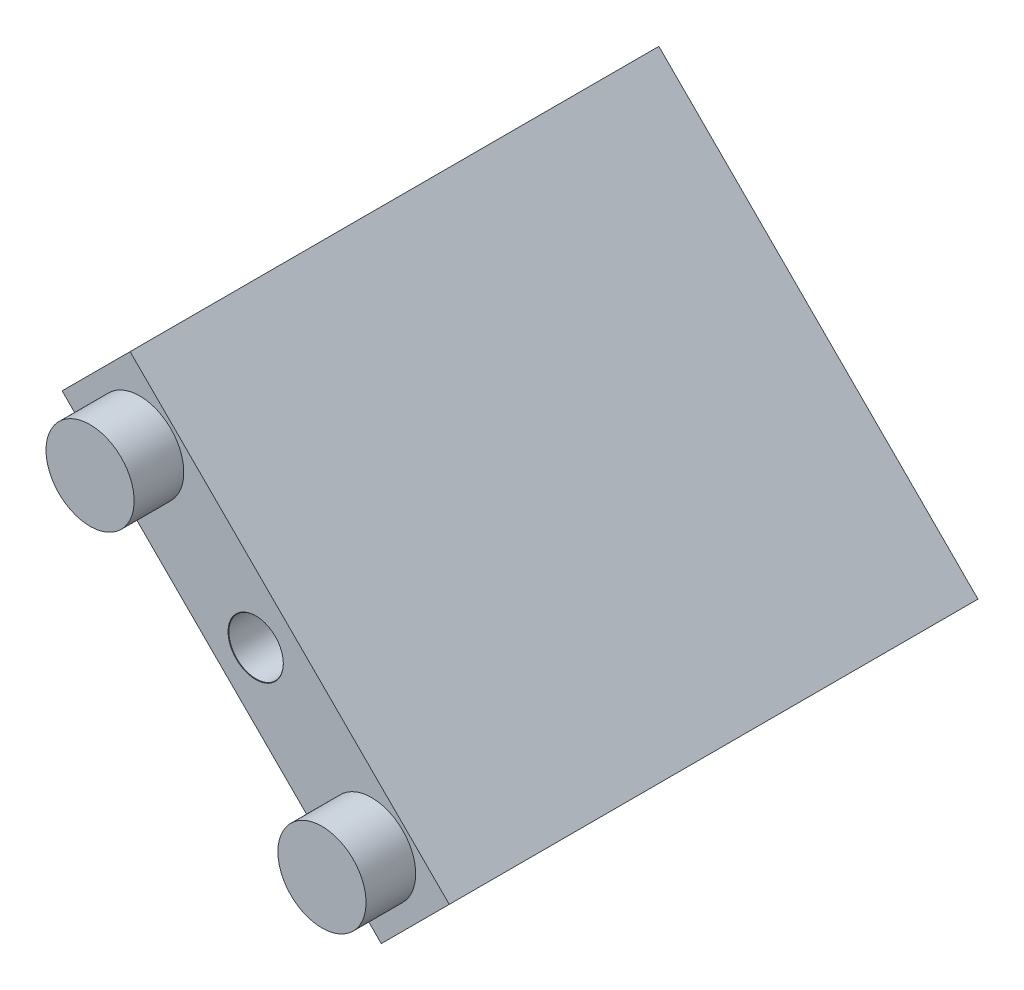
ISO-10303-21;
HEADER;
FILE_DESCRIPTION(('STEP AP214'),'2;1');
FILE_NAME('part.step','',(''),(''),'','','');
FILE_SCHEMA(('AUTOMOTIVE_DESIGN { 1 0 10303 214 1 1 1 1 }'));
ENDSEC;
DATA;
#1=APPLICATION_CONTEXT('core data for automotive mechanical design processes');
#2=APPLICATION_PROTOCOL_DEFINITION('international standard','automotive_design',2000,#1);
#3=PRODUCT_CONTEXT('',#1,'mechanical');
#4=PRODUCT('Part','Part','',(#3));
#5=PRODUCT_RELATED_PRODUCT_CATEGORY('part','',(#4));
#6=PRODUCT_DEFINITION_FORMATION('','',#4);
#7=PRODUCT_DEFINITION_CONTEXT('part definition',#1,'design');
#8=PRODUCT_DEFINITION('design','',#6,#7);
#9=PRODUCT_DEFINITION_SHAPE('','',#8);
#10=(LENGTH_UNIT() NAMED_UNIT(*) SI_UNIT(.MILLI.,.METRE.));
#11=(NAMED_UNIT(*) PLANE_ANGLE_UNIT() SI_UNIT($,.RADIAN.));
#12=(NAMED_UNIT(*) SI_UNIT($,.STERADIAN.) SOLID_ANGLE_UNIT());
#13=UNCERTAINTY_MEASURE_WITH_UNIT(LENGTH_MEASURE(1.E-05),#10,'distance_accuracy_value','');
#14=(GEOMETRIC_REPRESENTATION_CONTEXT(3) GLOBAL_UNCERTAINTY_ASSIGNED_CONTEXT((#13)) GLOBAL_UNIT_ASSIGNED_CONTEXT((#10,
#11,#12)) REPRESENTATION_CONTEXT('',''));
#15=CARTESIAN_POINT('',(0.,0.,0.));
#16=DIRECTION('',(0.,0.,1.));
#17=DIRECTION('',(1.,0.,0.));
#18=AXIS2_PLACEMENT_3D('',#15,#16,#17);
#19=CARTESIAN_POINT('',(-2.79532834472425,16.9362189533206,33.));
#20=DIRECTION('',(0.707106781186547,0.707106781186548,0.));
#21=DIRECTION('',(-0.707106781186548,0.707106781186547,0.));
#22=AXIS2_PLACEMENT_3D('',#19,#20,#21);
#23=PLANE('',#22);
#24=DIRECTION('',(0.707106781186547,-0.707106781186547,0.));
#25=VECTOR('',#24,1.);
#26=CARTESIAN_POINT('',(-2.79532834472425,16.9362189533206,0.));
#27=LINE('',#26,#25);
#28=CARTESIAN_POINT('',(-2.79532834472425,16.9362189533206,0.));
#29=VERTEX_POINT('',#28);
#30=CARTESIAN_POINT('',(17.1238696813008,-2.98297907270444,0.));
#31=VERTEX_POINT('',#30);
#32=EDGE_CURVE('E110',#29,#31,#27,.T.);
#33=ORIENTED_EDGE('',*,*,#32,.T.);
#34=DIRECTION('',(0.,0.,-1.));
#35=VECTOR('',#34,1.);
#36=CARTESIAN_POINT('',(17.1238696813008,-2.98297907270444,33.));
#37=LINE('',#36,#35);
#38=CARTESIAN_POINT('',(17.1238696813008,-2.98297907270444,33.));
#39=VERTEX_POINT('',#38);
#40=EDGE_CURVE('E11',#39,#31,#37,.T.);
#41=ORIENTED_EDGE('',*,*,#40,.F.);
#42=DIRECTION('',(0.707106781186547,-0.707106781186547,0.));
#43=VECTOR('',#42,1.);
#44=CARTESIAN_POINT('',(-2.79532834472425,16.9362189533206,33.));
#45=LINE('',#44,#43);
#46=CARTESIAN_POINT('',(-2.79532834472425,16.9362189533206,33.));
#47=VERTEX_POINT('',#46);
#48=EDGE_CURVE('E113',#47,#39,#45,.T.);
#49=ORIENTED_EDGE('',*,*,#48,.F.);
#50=DIRECTION('',(0.,0.,-1.));
#51=VECTOR('',#50,1.);
#52=CARTESIAN_POINT('',(-2.79532834472425,16.9362189533206,33.));
#53=LINE('',#52,#51);
#54=EDGE_CURVE('E119',#47,#29,#53,.T.);
#55=ORIENTED_EDGE('',*,*,#54,.T.);
#56=EDGE_LOOP('',(#33,#41,#49,#55));
#57=FACE_BOUND('',#56,.T.);
#58=ADVANCED_FACE('F32',(#57),#23,.F.);
#59=CARTESIAN_POINT('',(17.1238696813008,-2.98297907270444,33.));
#60=DIRECTION('',(-0.707106781186548,0.707106781186547,0.));
#61=DIRECTION('',(-0.707106781186547,-0.707106781186548,0.));
#62=AXIS2_PLACEMENT_3D('',#59,#60,#61);
#63=PLANE('',#62);
#64=DIRECTION('',(0.707106781186547,0.707106781186548,0.));
#65=VECTOR('',#64,1.);
#66=CARTESIAN_POINT('',(17.1238696813008,-2.98297907270444,0.));
#67=LINE('',#66,#65);
#68=CARTESIAN_POINT('',(21.3665103684201,1.25966161441484,0.));
#69=VERTEX_POINT('',#68);
#70=EDGE_CURVE('E122',#31,#69,#67,.T.);
#71=ORIENTED_EDGE('',*,*,#70,.T.);
#72=DIRECTION('',(0.,0.,-1.));
#73=VECTOR('',#72,1.);
#74=CARTESIAN_POINT('',(21.3665103684201,1.25966161441484,33.));
#75=LINE('',#74,#73);
#76=CARTESIAN_POINT('',(21.3665103684201,1.25966161441484,33.));
#77=VERTEX_POINT('',#76);
#78=EDGE_CURVE('E40',#77,#69,#75,.T.);
#79=ORIENTED_EDGE('',*,*,#78,.F.);
#80=DIRECTION('',(0.707106781186547,0.707106781186548,0.));
#81=VECTOR('',#80,1.);
#82=CARTESIAN_POINT('',(17.1238696813008,-2.98297907270444,33.));
#83=LINE('',#82,#81);
#84=EDGE_CURVE('E79',#39,#77,#83,.T.);
#85=ORIENTED_EDGE('',*,*,#84,.F.);
#86=ORIENTED_EDGE('',*,*,#40,.T.);
#87=EDGE_LOOP('',(#71,#79,#85,#86));
#88=FACE_BOUND('',#87,.T.);
#89=ADVANCED_FACE('F146',(#88),#63,.F.);
#90=CARTESIAN_POINT('',(21.3665103684201,1.25966161441484,33.));
#91=DIRECTION('',(-0.707106781186548,-0.707106781186547,0.));
#92=DIRECTION('',(0.707106781186547,-0.707106781186548,0.));
#93=AXIS2_PLACEMENT_3D('',#90,#91,#92);
#94=PLANE('',#93);
#95=DIRECTION('',(-0.707106781186547,0.707106781186548,0.));
#96=VECTOR('',#95,1.);
#97=CARTESIAN_POINT('',(21.3665103684201,1.25966161441484,0.));
#98=LINE('',#97,#96);
#99=CARTESIAN_POINT('',(1.44731234239504,21.1788596404399,0.));
#100=VERTEX_POINT('',#99);
#101=EDGE_CURVE('E66',#69,#100,#98,.T.);
#102=ORIENTED_EDGE('',*,*,#101,.T.);
#103=DIRECTION('',(0.,0.,-1.));
#104=VECTOR('',#103,1.);
#105=CARTESIAN_POINT('',(1.44731234239504,21.1788596404399,33.));
#106=LINE('',#105,#104);
#107=CARTESIAN_POINT('',(1.44731234239504,21.1788596404399,33.));
#108=VERTEX_POINT('',#107);
#109=EDGE_CURVE('E127',#108,#100,#106,.T.);
#110=ORIENTED_EDGE('',*,*,#109,.F.);
#111=DIRECTION('',(-0.707106781186547,0.707106781186548,0.));
#112=VECTOR('',#111,1.);
#113=CARTESIAN_POINT('',(21.3665103684201,1.25966161441484,33.));
#114=LINE('',#113,#112);
#115=EDGE_CURVE('E116',#77,#108,#114,.T.);
#116=ORIENTED_EDGE('',*,*,#115,.F.);
#117=ORIENTED_EDGE('',*,*,#78,.T.);
#118=EDGE_LOOP('',(#102,#110,#116,#117));
#119=FACE_BOUND('',#118,.T.);
#120=ADVANCED_FACE('F129',(#119),#94,.F.);
#121=CARTESIAN_POINT('',(1.44731234239504,21.1788596404399,33.));
#122=DIRECTION('',(0.707106781186547,-0.707106781186547,0.));
#123=DIRECTION('',(0.707106781186548,0.707106781186548,0.));
#124=AXIS2_PLACEMENT_3D('',#121,#122,#123);
#125=PLANE('',#124);
#126=DIRECTION('',(-0.707106781186548,-0.707106781186548,0.));
#127=VECTOR('',#126,1.);
#128=CARTESIAN_POINT('',(1.44731234239504,21.1788596404399,0.));
#129=LINE('',#128,#127);
#130=EDGE_CURVE('E72',#100,#29,#129,.T.);
#131=ORIENTED_EDGE('',*,*,#130,.T.);
#132=ORIENTED_EDGE('',*,*,#54,.F.);
#133=DIRECTION('',(-0.707106781186548,-0.707106781186548,0.));
#134=VECTOR('',#133,1.);
#135=CARTESIAN_POINT('',(1.44731234239504,21.1788596404399,33.));
#136=LINE('',#135,#134);
#137=EDGE_CURVE('E48',#108,#47,#136,.T.);
#138=ORIENTED_EDGE('',*,*,#137,.F.);
#139=ORIENTED_EDGE('',*,*,#109,.T.);
#140=EDGE_LOOP('',(#131,#132,#138,#139));
#141=FACE_BOUND('',#140,.T.);
#142=ADVANCED_FACE('F136',(#141),#125,.F.);
#143=CARTESIAN_POINT('',(0.,0.,33.));
#144=DIRECTION('',(0.,0.,1.));
#145=DIRECTION('',(1.,0.,0.));
#146=AXIS2_PLACEMENT_3D('',#143,#144,#145);
#147=PLANE('',#146);
#148=CARTESIAN_POINT('',(9.28559101184792,9.09794028386772,33.));
#149=DIRECTION('',(0.,0.,1.));
#150=DIRECTION('',(1.,0.,0.));
#151=AXIS2_PLACEMENT_3D('',#148,#149,#150);
#152=CIRCLE('',#151,1.725);
#153=CARTESIAN_POINT('',(11.0105910118479,9.09794028386772,33.));
#154=VERTEX_POINT('',#153);
#155=EDGE_CURVE('E100',#154,#154,#152,.T.);
#156=ORIENTED_EDGE('',*,*,#155,.F.);
#157=EDGE_LOOP('',(#156));
#158=FACE_BOUND('',#157,.T.);
#159=CARTESIAN_POINT('',(16.5228289172922,1.8607023784234,33.));
#160=DIRECTION('',(0.,0.,1.));
#161=DIRECTION('',(1.,0.,0.));
#162=AXIS2_PLACEMENT_3D('',#159,#160,#161);
#163=CIRCLE('',#162,2.75);
#164=CARTESIAN_POINT('',(13.7728289172922,1.8607023784234,33.));
#165=VERTEX_POINT('',#164);
#166=EDGE_CURVE('E93',#165,#165,#163,.T.);
#167=ORIENTED_EDGE('',*,*,#166,.F.);
#168=EDGE_LOOP('',(#167));
#169=FACE_BOUND('',#168,.T.);
#170=CARTESIAN_POINT('',(2.0483531064036,16.335178189312,33.));
#171=DIRECTION('',(0.,0.,1.));
#172=DIRECTION('',(1.,0.,0.));
#173=AXIS2_PLACEMENT_3D('',#170,#171,#172);
#174=CIRCLE('',#173,2.75);
#175=CARTESIAN_POINT('',(-0.701646893596396,16.335178189312,33.));
#176=VERTEX_POINT('',#175);
#177=EDGE_CURVE('E105',#176,#176,#174,.T.);
#178=ORIENTED_EDGE('',*,*,#177,.F.);
#179=EDGE_LOOP('',(#178));
#180=FACE_BOUND('',#179,.T.);
#181=ORIENTED_EDGE('',*,*,#48,.T.);
#182=ORIENTED_EDGE('',*,*,#84,.T.);
#183=ORIENTED_EDGE('',*,*,#115,.T.);
#184=ORIENTED_EDGE('',*,*,#137,.T.);
#185=EDGE_LOOP('',(#181,#182,#183,#184));
#186=FACE_BOUND('',#185,.T.);
#187=ADVANCED_FACE('F138',(#158,#169,#180,#186),#147,.T.);
#188=CARTESIAN_POINT('',(0.,0.,0.));
#189=DIRECTION('',(0.,0.,1.));
#190=DIRECTION('',(1.,0.,0.));
#191=AXIS2_PLACEMENT_3D('',#188,#189,#190);
#192=PLANE('',#191);
#193=ORIENTED_EDGE('',*,*,#32,.F.);
#194=ORIENTED_EDGE('',*,*,#130,.F.);
#195=ORIENTED_EDGE('',*,*,#101,.F.);
#196=ORIENTED_EDGE('',*,*,#70,.F.);
#197=EDGE_LOOP('',(#193,#194,#195,#196));
#198=FACE_BOUND('',#197,.T.);
#199=ADVANCED_FACE('F132',(#198),#192,.F.);
#200=CARTESIAN_POINT('',(2.0483531064036,16.335178189312,36.1));
#201=DIRECTION('',(0.,0.,-1.));
#202=DIRECTION('',(-1.,0.,0.));
#203=AXIS2_PLACEMENT_3D('',#200,#201,#202);
#204=CYLINDRICAL_SURFACE('',#203,2.75);
#205=CARTESIAN_POINT('',(2.0483531064036,16.335178189312,36.1));
#206=DIRECTION('',(0.,0.,1.));
#207=DIRECTION('',(1.,0.,0.));
#208=AXIS2_PLACEMENT_3D('',#205,#206,#207);
#209=CIRCLE('',#208,2.75);
#210=CARTESIAN_POINT('',(-0.701646893596396,16.335178189312,36.1));
#211=VERTEX_POINT('',#210);
#212=EDGE_CURVE('E107',#211,#211,#209,.T.);
#213=CARTESIAN_POINT('',(-0.701646893596396,16.335178189312,36.1));
#214=CARTESIAN_POINT('',(-0.701646893596396,16.335178189312,36.0677083333333));
#215=CARTESIAN_POINT('',(-0.701646893596396,16.335178189312,36.0354166666667));
#216=CARTESIAN_POINT('',(-0.701646893596396,16.335178189312,35.9708333333333));
#217=CARTESIAN_POINT('',(-0.701646893596396,16.335178189312,35.9385416666667));
#218=CARTESIAN_POINT('',(-0.701646893596396,16.335178189312,35.8739583333333));
#219=CARTESIAN_POINT('',(-0.701646893596396,16.335178189312,35.8416666666667));
#220=CARTESIAN_POINT('',(-0.701646893596396,16.335178189312,35.7770833333333));
#221=CARTESIAN_POINT('',(-0.701646893596396,16.335178189312,35.7447916666667));
#222=CARTESIAN_POINT('',(-0.701646893596396,16.335178189312,35.6802083333333));
#223=CARTESIAN_POINT('',(-0.701646893596396,16.335178189312,35.6479166666667));
#224=CARTESIAN_POINT('',(-0.701646893596396,16.335178189312,35.5833333333333));
#225=CARTESIAN_POINT('',(-0.701646893596396,16.335178189312,35.5510416666667));
#226=CARTESIAN_POINT('',(-0.701646893596396,16.335178189312,35.4864583333333));
#227=CARTESIAN_POINT('',(-0.701646893596396,16.335178189312,35.4541666666667));
#228=CARTESIAN_POINT('',(-0.701646893596396,16.335178189312,35.3895833333333));
#229=CARTESIAN_POINT('',(-0.701646893596396,16.335178189312,35.3572916666667));
#230=CARTESIAN_POINT('',(-0.701646893596396,16.335178189312,35.2927083333333));
#231=CARTESIAN_POINT('',(-0.701646893596396,16.335178189312,35.2604166666667));
#232=CARTESIAN_POINT('',(-0.701646893596396,16.335178189312,35.1958333333333));
#233=CARTESIAN_POINT('',(-0.701646893596396,16.335178189312,35.1635416666667));
#234=CARTESIAN_POINT('',(-0.701646893596396,16.335178189312,35.0989583333333));
#235=CARTESIAN_POINT('',(-0.701646893596396,16.335178189312,35.0666666666667));
#236=CARTESIAN_POINT('',(-0.701646893596396,16.335178189312,35.0020833333333));
#237=CARTESIAN_POINT('',(-0.701646893596396,16.335178189312,34.9697916666667));
#238=CARTESIAN_POINT('',(-0.701646893596396,16.335178189312,34.9052083333333));
#239=CARTESIAN_POINT('',(-0.701646893596396,16.335178189312,34.8729166666667));
#240=CARTESIAN_POINT('',(-0.701646893596396,16.335178189312,34.8083333333333));
#241=CARTESIAN_POINT('',(-0.701646893596396,16.335178189312,34.7760416666667));
#242=CARTESIAN_POINT('',(-0.701646893596396,16.335178189312,34.7114583333333));
#243=CARTESIAN_POINT('',(-0.701646893596396,16.335178189312,34.6791666666667));
#244=CARTESIAN_POINT('',(-0.701646893596396,16.335178189312,34.6145833333333));
#245=CARTESIAN_POINT('',(-0.701646893596396,16.335178189312,34.5822916666667));
#246=CARTESIAN_POINT('',(-0.701646893596396,16.335178189312,34.5177083333333));
#247=CARTESIAN_POINT('',(-0.701646893596396,16.335178189312,34.4854166666667));
#248=CARTESIAN_POINT('',(-0.701646893596396,16.335178189312,34.4208333333333));
#249=CARTESIAN_POINT('',(-0.701646893596396,16.335178189312,34.3885416666667));
#250=CARTESIAN_POINT('',(-0.701646893596396,16.335178189312,34.3239583333333));
#251=CARTESIAN_POINT('',(-0.701646893596396,16.335178189312,34.2916666666667));
#252=CARTESIAN_POINT('',(-0.701646893596396,16.335178189312,34.2270833333333));
#253=CARTESIAN_POINT('',(-0.701646893596396,16.335178189312,34.1947916666667));
#254=CARTESIAN_POINT('',(-0.701646893596396,16.335178189312,34.1302083333333));
#255=CARTESIAN_POINT('',(-0.701646893596396,16.335178189312,34.0979166666667));
#256=CARTESIAN_POINT('',(-0.701646893596396,16.335178189312,34.0333333333333));
#257=CARTESIAN_POINT('',(-0.701646893596396,16.335178189312,34.0010416666667));
#258=CARTESIAN_POINT('',(-0.701646893596396,16.335178189312,33.9364583333333));
#259=CARTESIAN_POINT('',(-0.701646893596396,16.335178189312,33.9041666666667));
#260=CARTESIAN_POINT('',(-0.701646893596396,16.335178189312,33.8395833333333));
#261=CARTESIAN_POINT('',(-0.701646893596396,16.335178189312,33.8072916666667));
#262=CARTESIAN_POINT('',(-0.701646893596396,16.335178189312,33.7427083333333));
#263=CARTESIAN_POINT('',(-0.701646893596396,16.335178189312,33.7104166666667));
#264=CARTESIAN_POINT('',(-0.701646893596396,16.335178189312,33.6458333333333));
#265=CARTESIAN_POINT('',(-0.701646893596396,16.335178189312,33.6135416666667));
#266=CARTESIAN_POINT('',(-0.701646893596396,16.335178189312,33.5489583333333));
#267=CARTESIAN_POINT('',(-0.701646893596396,16.335178189312,33.5166666666667));
#268=CARTESIAN_POINT('',(-0.701646893596396,16.335178189312,33.4520833333333));
#269=CARTESIAN_POINT('',(-0.701646893596396,16.335178189312,33.4197916666667));
#270=CARTESIAN_POINT('',(-0.701646893596396,16.335178189312,33.3552083333333));
#271=CARTESIAN_POINT('',(-0.701646893596396,16.335178189312,33.3229166666667));
#272=CARTESIAN_POINT('',(-0.701646893596396,16.335178189312,33.2583333333333));
#273=CARTESIAN_POINT('',(-0.701646893596396,16.335178189312,33.2260416666667));
#274=CARTESIAN_POINT('',(-0.701646893596396,16.335178189312,33.1614583333333));
#275=CARTESIAN_POINT('',(-0.701646893596396,16.335178189312,33.1291666666667));
#276=CARTESIAN_POINT('',(-0.701646893596396,16.335178189312,33.0645833333333));
#277=CARTESIAN_POINT('',(-0.701646893596396,16.335178189312,33.0322916666667));
#278=CARTESIAN_POINT('',(-0.701646893596396,16.335178189312,33.));
#279=B_SPLINE_CURVE_WITH_KNOTS('',3,(#213,#214,#215,#216,#217,#218,#219,#220,#221,#222,#223,
#224,#225,#226,#227,#228,#229,#230,#231,#232,#233,#234,#235,#236,#237,#238,#239,#240,#241,#242,
#243,#244,#245,#246,#247,#248,#249,#250,#251,#252,#253,#254,#255,#256,#257,#258,#259,#260,#261,
#262,#263,#264,#265,#266,#267,#268,#269,#270,#271,#272,#273,#274,#275,#276,#277,#278),
.UNSPECIFIED.,.F.,.F.,(4,2,2,2,2,2,2,2,2,2,2,2,2,2,2,2,2,2,2,2,2,2,2,2,2,2,2,2,2,2,2,2,4),(0.,
0.0968750000000032,0.193750000000006,0.290625000000003,0.387500000000006,0.484375000000002,
0.581250000000005,0.678125000000002,0.775000000000005,0.871875000000001,0.968750000000004,
1.065625,1.1625,1.259375,1.35625,1.45312500000001,1.55,1.64687500000001,1.74375,
1.84062500000001,1.9375,2.03437500000001,2.13125,2.228125,2.325,2.421875,2.51875,2.615625,
2.7125,2.809375,2.90625000000001,3.003125,3.10000000000001),.UNSPECIFIED.);
#280=EDGE_CURVE('BSEAM173',#211,#176,#279,.T.);
#281=ORIENTED_EDGE('',*,*,#212,.F.);
#282=ORIENTED_EDGE('',*,*,#177,.T.);
#283=ORIENTED_EDGE('',*,*,#280,.T.);
#284=ORIENTED_EDGE('',*,*,#280,.F.);
#285=EDGE_LOOP('',(#281,#283,#282,#284));
#286=FACE_BOUND('',#285,.T.);
#287=ADVANCED_FACE('F173',(#286),#204,.T.);
#288=CARTESIAN_POINT('',(2.0483531064036,16.335178189312,36.1));
#289=DIRECTION('',(0.,0.,1.));
#290=DIRECTION('',(1.,0.,0.));
#291=AXIS2_PLACEMENT_3D('',#288,#289,#290);
#292=PLANE('',#291);
#293=ORIENTED_EDGE('',*,*,#212,.T.);
#294=EDGE_LOOP('',(#293));
#295=FACE_BOUND('',#294,.T.);
#296=ADVANCED_FACE('F181',(#295),#292,.T.);
#297=CARTESIAN_POINT('',(16.5228289172922,1.8607023784234,36.1));
#298=DIRECTION('',(0.,0.,-1.));
#299=DIRECTION('',(-1.,0.,0.));
#300=AXIS2_PLACEMENT_3D('',#297,#298,#299);
#301=CYLINDRICAL_SURFACE('',#300,2.75);
#302=CARTESIAN_POINT('',(16.5228289172922,1.8607023784234,36.1));
#303=DIRECTION('',(0.,0.,1.));
#304=DIRECTION('',(1.,0.,0.));
#305=AXIS2_PLACEMENT_3D('',#302,#303,#304);
#306=CIRCLE('',#305,2.75);
#307=CARTESIAN_POINT('',(13.7728289172922,1.8607023784234,36.1));
#308=VERTEX_POINT('',#307);
#309=EDGE_CURVE('E97',#308,#308,#306,.T.);
#310=CARTESIAN_POINT('',(13.7728289172922,1.8607023784234,36.1));
#311=CARTESIAN_POINT('',(13.7728289172922,1.8607023784234,36.0677083333333));
#312=CARTESIAN_POINT('',(13.7728289172922,1.8607023784234,36.0354166666667));
#313=CARTESIAN_POINT('',(13.7728289172922,1.8607023784234,35.9708333333333));
#314=CARTESIAN_POINT('',(13.7728289172922,1.8607023784234,35.9385416666667));
#315=CARTESIAN_POINT('',(13.7728289172922,1.8607023784234,35.8739583333333));
#316=CARTESIAN_POINT('',(13.7728289172922,1.8607023784234,35.8416666666667));
#317=CARTESIAN_POINT('',(13.7728289172922,1.8607023784234,35.7770833333333));
#318=CARTESIAN_POINT('',(13.7728289172922,1.8607023784234,35.7447916666667));
#319=CARTESIAN_POINT('',(13.7728289172922,1.8607023784234,35.6802083333333));
#320=CARTESIAN_POINT('',(13.7728289172922,1.8607023784234,35.6479166666667));
#321=CARTESIAN_POINT('',(13.7728289172922,1.8607023784234,35.5833333333333));
#322=CARTESIAN_POINT('',(13.7728289172922,1.8607023784234,35.5510416666667));
#323=CARTESIAN_POINT('',(13.7728289172922,1.8607023784234,35.4864583333333));
#324=CARTESIAN_POINT('',(13.7728289172922,1.8607023784234,35.4541666666667));
#325=CARTESIAN_POINT('',(13.7728289172922,1.8607023784234,35.3895833333333));
#326=CARTESIAN_POINT('',(13.7728289172922,1.8607023784234,35.3572916666667));
#327=CARTESIAN_POINT('',(13.7728289172922,1.8607023784234,35.2927083333333));
#328=CARTESIAN_POINT('',(13.7728289172922,1.8607023784234,35.2604166666667));
#329=CARTESIAN_POINT('',(13.7728289172922,1.8607023784234,35.1958333333333));
#330=CARTESIAN_POINT('',(13.7728289172922,1.8607023784234,35.1635416666667));
#331=CARTESIAN_POINT('',(13.7728289172922,1.8607023784234,35.0989583333333));
#332=CARTESIAN_POINT('',(13.7728289172922,1.8607023784234,35.0666666666667));
#333=CARTESIAN_POINT('',(13.7728289172922,1.8607023784234,35.0020833333333));
#334=CARTESIAN_POINT('',(13.7728289172922,1.8607023784234,34.9697916666667));
#335=CARTESIAN_POINT('',(13.7728289172922,1.8607023784234,34.9052083333333));
#336=CARTESIAN_POINT('',(13.7728289172922,1.8607023784234,34.8729166666667));
#337=CARTESIAN_POINT('',(13.7728289172922,1.8607023784234,34.8083333333333));
#338=CARTESIAN_POINT('',(13.7728289172922,1.8607023784234,34.7760416666667));
#339=CARTESIAN_POINT('',(13.7728289172922,1.8607023784234,34.7114583333333));
#340=CARTESIAN_POINT('',(13.7728289172922,1.8607023784234,34.6791666666667));
#341=CARTESIAN_POINT('',(13.7728289172922,1.8607023784234,34.6145833333333));
#342=CARTESIAN_POINT('',(13.7728289172922,1.8607023784234,34.5822916666667));
#343=CARTESIAN_POINT('',(13.7728289172922,1.8607023784234,34.5177083333333));
#344=CARTESIAN_POINT('',(13.7728289172922,1.8607023784234,34.4854166666667));
#345=CARTESIAN_POINT('',(13.7728289172922,1.8607023784234,34.4208333333333));
#346=CARTESIAN_POINT('',(13.7728289172922,1.8607023784234,34.3885416666667));
#347=CARTESIAN_POINT('',(13.7728289172922,1.8607023784234,34.3239583333333));
#348=CARTESIAN_POINT('',(13.7728289172922,1.8607023784234,34.2916666666667));
#349=CARTESIAN_POINT('',(13.7728289172922,1.8607023784234,34.2270833333333));
#350=CARTESIAN_POINT('',(13.7728289172922,1.8607023784234,34.1947916666667));
#351=CARTESIAN_POINT('',(13.7728289172922,1.8607023784234,34.1302083333333));
#352=CARTESIAN_POINT('',(13.7728289172922,1.8607023784234,34.0979166666667));
#353=CARTESIAN_POINT('',(13.7728289172922,1.8607023784234,34.0333333333333));
#354=CARTESIAN_POINT('',(13.7728289172922,1.8607023784234,34.0010416666667));
#355=CARTESIAN_POINT('',(13.7728289172922,1.8607023784234,33.9364583333333));
#356=CARTESIAN_POINT('',(13.7728289172922,1.8607023784234,33.9041666666667));
#357=CARTESIAN_POINT('',(13.7728289172922,1.8607023784234,33.8395833333333));
#358=CARTESIAN_POINT('',(13.7728289172922,1.8607023784234,33.8072916666667));
#359=CARTESIAN_POINT('',(13.7728289172922,1.8607023784234,33.7427083333333));
#360=CARTESIAN_POINT('',(13.7728289172922,1.8607023784234,33.7104166666667));
#361=CARTESIAN_POINT('',(13.7728289172922,1.8607023784234,33.6458333333333));
#362=CARTESIAN_POINT('',(13.7728289172922,1.8607023784234,33.6135416666667));
#363=CARTESIAN_POINT('',(13.7728289172922,1.8607023784234,33.5489583333333));
#364=CARTESIAN_POINT('',(13.7728289172922,1.8607023784234,33.5166666666667));
#365=CARTESIAN_POINT('',(13.7728289172922,1.8607023784234,33.4520833333333));
#366=CARTESIAN_POINT('',(13.7728289172922,1.8607023784234,33.4197916666667));
#367=CARTESIAN_POINT('',(13.7728289172922,1.8607023784234,33.3552083333333));
#368=CARTESIAN_POINT('',(13.7728289172922,1.8607023784234,33.3229166666667));
#369=CARTESIAN_POINT('',(13.7728289172922,1.8607023784234,33.2583333333333));
#370=CARTESIAN_POINT('',(13.7728289172922,1.8607023784234,33.2260416666667));
#371=CARTESIAN_POINT('',(13.7728289172922,1.8607023784234,33.1614583333333));
#372=CARTESIAN_POINT('',(13.7728289172922,1.8607023784234,33.1291666666667));
#373=CARTESIAN_POINT('',(13.7728289172922,1.8607023784234,33.0645833333333));
#374=CARTESIAN_POINT('',(13.7728289172922,1.8607023784234,33.0322916666667));
#375=CARTESIAN_POINT('',(13.7728289172922,1.8607023784234,33.));
#376=B_SPLINE_CURVE_WITH_KNOTS('',3,(#310,#311,#312,#313,#314,#315,#316,#317,#318,#319,#320,
#321,#322,#323,#324,#325,#326,#327,#328,#329,#330,#331,#332,#333,#334,#335,#336,#337,#338,#339,
#340,#341,#342,#343,#344,#345,#346,#347,#348,#349,#350,#351,#352,#353,#354,#355,#356,#357,#358,
#359,#360,#361,#362,#363,#364,#365,#366,#367,#368,#369,#370,#371,#372,#373,#374,#375),
.UNSPECIFIED.,.F.,.F.,(4,2,2,2,2,2,2,2,2,2,2,2,2,2,2,2,2,2,2,2,2,2,2,2,2,2,2,2,2,2,2,2,4),(0.,
0.0968750000000032,0.193750000000006,0.290625000000003,0.387500000000006,0.484375000000002,
0.581250000000005,0.678125000000002,0.775000000000005,0.871875000000001,0.968750000000004,
1.065625,1.1625,1.259375,1.35625,1.45312500000001,1.55,1.64687500000001,1.74375,
1.84062500000001,1.9375,2.03437500000001,2.13125,2.228125,2.325,2.421875,2.51875,2.615625,
2.7125,2.809375,2.90625000000001,3.003125,3.10000000000001),.UNSPECIFIED.);
#377=EDGE_CURVE('BSEAM191',#308,#165,#376,.T.);
#378=ORIENTED_EDGE('',*,*,#309,.F.);
#379=ORIENTED_EDGE('',*,*,#166,.T.);
#380=ORIENTED_EDGE('',*,*,#377,.T.);
#381=ORIENTED_EDGE('',*,*,#377,.F.);
#382=EDGE_LOOP('',(#378,#380,#379,#381));
#383=FACE_BOUND('',#382,.T.);
#384=ADVANCED_FACE('F191',(#383),#301,.T.);
#385=CARTESIAN_POINT('',(16.5228289172922,1.8607023784234,36.1));
#386=DIRECTION('',(0.,0.,1.));
#387=DIRECTION('',(1.,0.,0.));
#388=AXIS2_PLACEMENT_3D('',#385,#386,#387);
#389=PLANE('',#388);
#390=ORIENTED_EDGE('',*,*,#309,.T.);
#391=EDGE_LOOP('',(#390));
#392=FACE_BOUND('',#391,.T.);
#393=ADVANCED_FACE('F87',(#392),#389,.T.);
#394=CARTESIAN_POINT('',(9.28559101184792,9.09794028386772,30.));
#395=DIRECTION('',(0.,0.,1.));
#396=DIRECTION('',(1.,0.,0.));
#397=AXIS2_PLACEMENT_3D('',#394,#395,#396);
#398=CONICAL_SURFACE('',#397,1.7,1.02974425867665);
#399=CARTESIAN_POINT('',(9.28559101184792,9.09794028386772,28.9785369476532));
#400=VERTEX_POINT('',#399);
#401=VERTEX_LOOP('',#400);
#402=FACE_BOUND('',#401,.T.);
#403=CARTESIAN_POINT('',(9.28559101184792,9.09794028386772,30.));
#404=DIRECTION('',(0.,0.,1.));
#405=DIRECTION('',(1.,0.,0.));
#406=AXIS2_PLACEMENT_3D('',#403,#404,#405);
#407=CIRCLE('',#406,1.7);
#408=CARTESIAN_POINT('',(10.9855910118479,9.09794028386772,30.));
#409=VERTEX_POINT('',#408);
#410=EDGE_CURVE('E91',#409,#409,#407,.T.);
#411=ORIENTED_EDGE('',*,*,#410,.T.);
#412=EDGE_LOOP('',(#411));
#413=FACE_BOUND('',#412,.T.);
#414=ADVANCED_FACE('F83',(#402,#413),#398,.F.);
#415=CARTESIAN_POINT('',(9.28559101184792,9.09794028386772,33.));
#416=DIRECTION('',(0.,0.,1.));
#417=DIRECTION('',(1.,0.,0.));
#418=AXIS2_PLACEMENT_3D('',#415,#416,#417);
#419=CYLINDRICAL_SURFACE('',#418,1.7);
#420=ORIENTED_EDGE('',*,*,#410,.F.);
#421=EDGE_LOOP('',(#420));
#422=FACE_BOUND('',#421,.T.);
#423=CARTESIAN_POINT('',(9.28559101184792,9.09794028386772,32.975));
#424=DIRECTION('',(0.,0.,1.));
#425=DIRECTION('',(1.,0.,0.));
#426=AXIS2_PLACEMENT_3D('',#423,#424,#425);
#427=CIRCLE('',#426,1.7);
#428=CARTESIAN_POINT('',(10.9855910118479,9.09794028386772,32.975));
#429=VERTEX_POINT('',#428);
#430=EDGE_CURVE('E94',#429,#429,#427,.T.);
#431=ORIENTED_EDGE('',*,*,#430,.T.);
#432=EDGE_LOOP('',(#431));
#433=FACE_BOUND('',#432,.T.);
#434=ADVANCED_FACE('F86',(#422,#433),#419,.F.);
#435=CARTESIAN_POINT('',(9.28559101184792,9.09794028386772,33.));
#436=DIRECTION('',(0.,0.,1.));
#437=DIRECTION('',(1.,0.,0.));
#438=AXIS2_PLACEMENT_3D('',#435,#436,#437);
#439=CONICAL_SURFACE('',#438,1.725,0.785398163397518);
#440=ORIENTED_EDGE('',*,*,#430,.F.);
#441=EDGE_LOOP('',(#440));
#442=FACE_BOUND('',#441,.T.);
#443=ORIENTED_EDGE('',*,*,#155,.T.);
#444=EDGE_LOOP('',(#443));
#445=FACE_BOUND('',#444,.T.);
#446=ADVANCED_FACE('F230',(#442,#445),#439,.F.);
#447=CLOSED_SHELL('',(#58,#89,#120,#142,#187,#199,#287,#296,#384,#393,#414,#434,#446));
#448=MANIFOLD_SOLID_BREP('B2',#447);
#449=ADVANCED_BREP_SHAPE_REPRESENTATION('',(#18,#448),#14);
#450=SHAPE_DEFINITION_REPRESENTATION(#9,#449);
ENDSEC;
END-ISO-10303-21;
